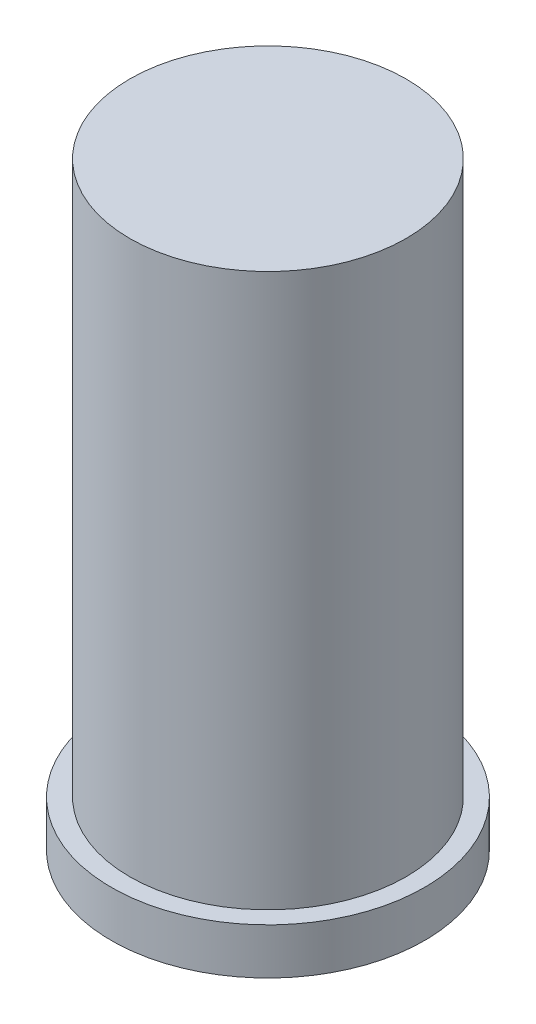
ISO-10303-21;
HEADER;
FILE_DESCRIPTION(('STEP AP214'),'2;1');
FILE_NAME('part.step','',(''),(''),'','','');
FILE_SCHEMA(('AUTOMOTIVE_DESIGN { 1 0 10303 214 1 1 1 1 }'));
ENDSEC;
DATA;
#1=APPLICATION_CONTEXT('core data for automotive mechanical design processes');
#2=APPLICATION_PROTOCOL_DEFINITION('international standard','automotive_design',2000,#1);
#3=PRODUCT_CONTEXT('',#1,'mechanical');
#4=PRODUCT('Part','Part','',(#3));
#5=PRODUCT_RELATED_PRODUCT_CATEGORY('part','',(#4));
#6=PRODUCT_DEFINITION_FORMATION('','',#4);
#7=PRODUCT_DEFINITION_CONTEXT('part definition',#1,'design');
#8=PRODUCT_DEFINITION('design','',#6,#7);
#9=PRODUCT_DEFINITION_SHAPE('','',#8);
#10=(LENGTH_UNIT() NAMED_UNIT(*) SI_UNIT(.MILLI.,.METRE.));
#11=(NAMED_UNIT(*) PLANE_ANGLE_UNIT() SI_UNIT($,.RADIAN.));
#12=(NAMED_UNIT(*) SI_UNIT($,.STERADIAN.) SOLID_ANGLE_UNIT());
#13=UNCERTAINTY_MEASURE_WITH_UNIT(LENGTH_MEASURE(1.E-05),#10,'distance_accuracy_value','');
#14=(GEOMETRIC_REPRESENTATION_CONTEXT(3) GLOBAL_UNCERTAINTY_ASSIGNED_CONTEXT((#13)) GLOBAL_UNIT_ASSIGNED_CONTEXT((#10,
#11,#12)) REPRESENTATION_CONTEXT('',''));
#15=CARTESIAN_POINT('',(0.,0.,0.));
#16=DIRECTION('',(0.,0.,1.));
#17=DIRECTION('',(1.,0.,0.));
#18=AXIS2_PLACEMENT_3D('',#15,#16,#17);
#19=CARTESIAN_POINT('',(0.,6.,0.));
#20=DIRECTION('',(0.,-1.,0.));
#21=DIRECTION('',(0.,0.,-1.));
#22=AXIS2_PLACEMENT_3D('',#19,#20,#21);
#23=CYLINDRICAL_SURFACE('',#22,1.5);
#24=CARTESIAN_POINT('',(0.,6.,0.));
#25=DIRECTION('',(0.,1.,0.));
#26=DIRECTION('',(0.,0.,1.));
#27=AXIS2_PLACEMENT_3D('',#24,#25,#26);
#28=CIRCLE('',#27,1.5);
#29=CARTESIAN_POINT('',(0.,6.,1.5));
#30=VERTEX_POINT('',#29);
#31=EDGE_CURVE('E10',#30,#30,#28,.T.);
#32=ORIENTED_EDGE('',*,*,#31,.F.);
#33=EDGE_LOOP('',(#32));
#34=FACE_BOUND('',#33,.T.);
#35=CARTESIAN_POINT('',(0.,0.,0.));
#36=DIRECTION('',(0.,1.,0.));
#37=DIRECTION('',(0.,0.,1.));
#38=AXIS2_PLACEMENT_3D('',#35,#36,#37);
#39=CIRCLE('',#38,1.5);
#40=CARTESIAN_POINT('',(0.,0.,1.5));
#41=VERTEX_POINT('',#40);
#42=EDGE_CURVE('E40',#41,#41,#39,.T.);
#43=ORIENTED_EDGE('',*,*,#42,.T.);
#44=EDGE_LOOP('',(#43));
#45=FACE_BOUND('',#44,.T.);
#46=ADVANCED_FACE('F37',(#34,#45),#23,.T.);
#47=CARTESIAN_POINT('',(0.,6.,0.));
#48=DIRECTION('',(0.,1.,0.));
#49=DIRECTION('',(0.,0.,1.));
#50=AXIS2_PLACEMENT_3D('',#47,#48,#49);
#51=PLANE('',#50);
#52=ORIENTED_EDGE('',*,*,#31,.T.);
#53=EDGE_LOOP('',(#52));
#54=FACE_BOUND('',#53,.T.);
#55=ADVANCED_FACE('F60',(#54),#51,.T.);
#56=CARTESIAN_POINT('',(0.,-0.5,0.));
#57=DIRECTION('',(0.,1.,0.));
#58=DIRECTION('',(0.,0.,1.));
#59=AXIS2_PLACEMENT_3D('',#56,#57,#58);
#60=CYLINDRICAL_SURFACE('',#59,1.7);
#61=CARTESIAN_POINT('',(0.,-0.5,0.));
#62=DIRECTION('',(0.,-1.,0.));
#63=DIRECTION('',(0.,0.,-1.));
#64=AXIS2_PLACEMENT_3D('',#61,#62,#63);
#65=CIRCLE('',#64,1.7);
#66=CARTESIAN_POINT('',(0.,-0.5,-1.7));
#67=VERTEX_POINT('',#66);
#68=EDGE_CURVE('E47',#67,#67,#65,.T.);
#69=ORIENTED_EDGE('',*,*,#68,.F.);
#70=EDGE_LOOP('',(#69));
#71=FACE_BOUND('',#70,.T.);
#72=CARTESIAN_POINT('',(0.,0.,0.));
#73=DIRECTION('',(0.,-1.,0.));
#74=DIRECTION('',(0.,0.,-1.));
#75=AXIS2_PLACEMENT_3D('',#72,#73,#74);
#76=CIRCLE('',#75,1.7);
#77=CARTESIAN_POINT('',(0.,0.,-1.7));
#78=VERTEX_POINT('',#77);
#79=EDGE_CURVE('E49',#78,#78,#76,.T.);
#80=ORIENTED_EDGE('',*,*,#79,.T.);
#81=EDGE_LOOP('',(#80));
#82=FACE_BOUND('',#81,.T.);
#83=ADVANCED_FACE('F57',(#71,#82),#60,.T.);
#84=CARTESIAN_POINT('',(0.,-0.5,0.));
#85=DIRECTION('',(0.,-1.,0.));
#86=DIRECTION('',(0.,0.,-1.));
#87=AXIS2_PLACEMENT_3D('',#84,#85,#86);
#88=PLANE('',#87);
#89=ORIENTED_EDGE('',*,*,#68,.T.);
#90=EDGE_LOOP('',(#89));
#91=FACE_BOUND('',#90,.T.);
#92=ADVANCED_FACE('F55',(#91),#88,.T.);
#93=CARTESIAN_POINT('',(0.,0.,0.));
#94=DIRECTION('',(0.,-1.,0.));
#95=DIRECTION('',(0.,0.,-1.));
#96=AXIS2_PLACEMENT_3D('',#93,#94,#95);
#97=PLANE('',#96);
#98=ORIENTED_EDGE('',*,*,#42,.F.);
#99=EDGE_LOOP('',(#98));
#100=FACE_BOUND('',#99,.T.);
#101=ORIENTED_EDGE('',*,*,#79,.F.);
#102=EDGE_LOOP('',(#101));
#103=FACE_BOUND('',#102,.T.);
#104=ADVANCED_FACE('F64',(#100,#103),#97,.F.);
#105=CLOSED_SHELL('',(#46,#55,#83,#92,#104));
#106=MANIFOLD_SOLID_BREP('B2',#105);
#107=ADVANCED_BREP_SHAPE_REPRESENTATION('',(#18,#106),#14);
#108=SHAPE_DEFINITION_REPRESENTATION(#9,#107);
ENDSEC;
END-ISO-10303-21;
